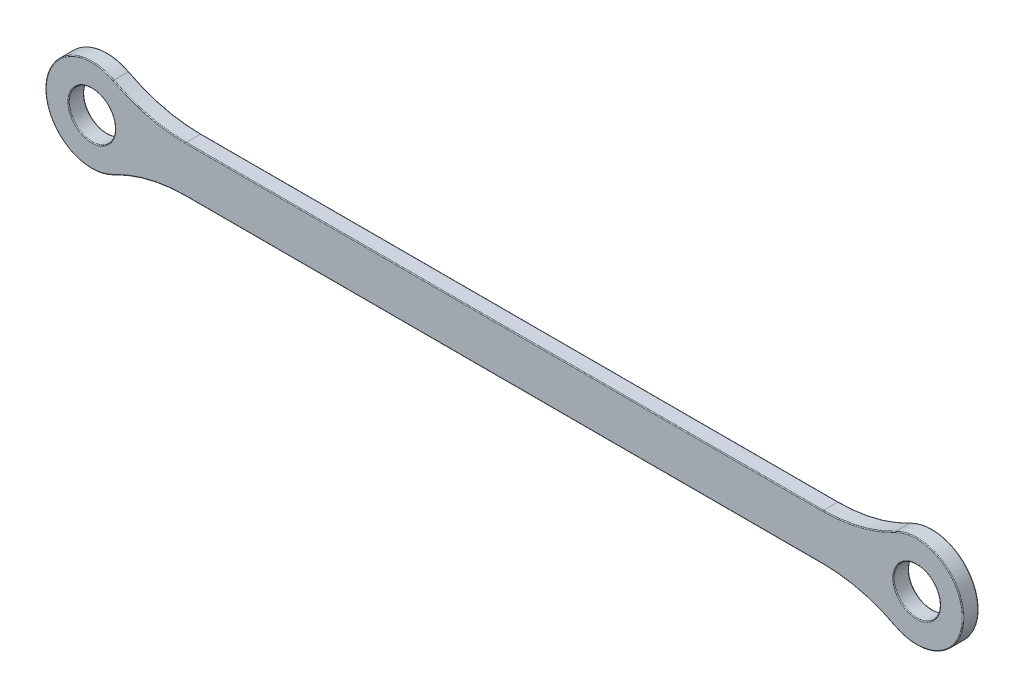
ISO-10303-21;
HEADER;
FILE_DESCRIPTION(('STEP AP214'),'2;1');
FILE_NAME('part.step','',(''),(''),'','','');
FILE_SCHEMA(('AUTOMOTIVE_DESIGN { 1 0 10303 214 1 1 1 1 }'));
ENDSEC;
DATA;
#1=APPLICATION_CONTEXT('core data for automotive mechanical design processes');
#2=APPLICATION_PROTOCOL_DEFINITION('international standard','automotive_design',2000,#1);
#3=PRODUCT_CONTEXT('',#1,'mechanical');
#4=PRODUCT('Part','Part','',(#3));
#5=PRODUCT_RELATED_PRODUCT_CATEGORY('part','',(#4));
#6=PRODUCT_DEFINITION_FORMATION('','',#4);
#7=PRODUCT_DEFINITION_CONTEXT('part definition',#1,'design');
#8=PRODUCT_DEFINITION('design','',#6,#7);
#9=PRODUCT_DEFINITION_SHAPE('','',#8);
#10=(LENGTH_UNIT() NAMED_UNIT(*) SI_UNIT(.MILLI.,.METRE.));
#11=(NAMED_UNIT(*) PLANE_ANGLE_UNIT() SI_UNIT($,.RADIAN.));
#12=(NAMED_UNIT(*) SI_UNIT($,.STERADIAN.) SOLID_ANGLE_UNIT());
#13=UNCERTAINTY_MEASURE_WITH_UNIT(LENGTH_MEASURE(1.E-05),#10,'distance_accuracy_value','');
#14=(GEOMETRIC_REPRESENTATION_CONTEXT(3) GLOBAL_UNCERTAINTY_ASSIGNED_CONTEXT((#13)) GLOBAL_UNIT_ASSIGNED_CONTEXT((#10,
#11,#12)) REPRESENTATION_CONTEXT('',''));
#15=CARTESIAN_POINT('',(0.,0.,0.));
#16=DIRECTION('',(0.,0.,1.));
#17=DIRECTION('',(1.,0.,0.));
#18=AXIS2_PLACEMENT_3D('',#15,#16,#17);
#19=CARTESIAN_POINT('',(-16.6441231158871,156.850203209432,3.));
#20=DIRECTION('',(0.,0.,-1.));
#21=DIRECTION('',(-1.,0.,0.));
#22=AXIS2_PLACEMENT_3D('',#19,#20,#21);
#23=CYLINDRICAL_SURFACE('',#22,9.00000000000002);
#24=DIRECTION('',(0.,0.,-1.));
#25=VECTOR('',#24,1.);
#26=CARTESIAN_POINT('',(-20.841015457304,164.811741670971,3.));
#27=LINE('',#26,#25);
#28=CARTESIAN_POINT('',(-20.841015457304,164.811741670971,0.15));
#29=VERTEX_POINT('',#28);
#30=CARTESIAN_POINT('',(-20.841015457304,164.811741670971,2.85));
#31=VERTEX_POINT('',#30);
#32=EDGE_CURVE('E303',#29,#31,#27,.F.);
#33=ORIENTED_EDGE('',*,*,#32,.T.);
#34=CARTESIAN_POINT('',(-16.6441231158871,156.850203209432,2.85));
#35=DIRECTION('',(0.,0.,1.));
#36=DIRECTION('',(1.,0.,0.));
#37=AXIS2_PLACEMENT_3D('',#34,#35,#36);
#38=CIRCLE('',#37,9.00000000000002);
#39=CARTESIAN_POINT('',(-20.841015457304,148.888664747894,2.85));
#40=VERTEX_POINT('',#39);
#41=EDGE_CURVE('E215',#31,#40,#38,.F.);
#42=ORIENTED_EDGE('',*,*,#41,.T.);
#43=DIRECTION('',(0.,0.,-1.));
#44=VECTOR('',#43,1.);
#45=CARTESIAN_POINT('',(-20.841015457304,148.888664747894,3.));
#46=LINE('',#45,#44);
#47=CARTESIAN_POINT('',(-20.841015457304,148.888664747894,0.15));
#48=VERTEX_POINT('',#47);
#49=EDGE_CURVE('E308',#40,#48,#46,.T.);
#50=ORIENTED_EDGE('',*,*,#49,.T.);
#51=CARTESIAN_POINT('',(-16.6441231158871,156.850203209432,0.15));
#52=DIRECTION('',(0.,0.,1.));
#53=DIRECTION('',(1.,0.,0.));
#54=AXIS2_PLACEMENT_3D('',#51,#52,#53);
#55=CIRCLE('',#54,9.00000000000002);
#56=EDGE_CURVE('E213',#48,#29,#55,.T.);
#57=ORIENTED_EDGE('',*,*,#56,.T.);
#58=EDGE_LOOP('',(#33,#42,#50,#57));
#59=FACE_BOUND('',#58,.T.);
#60=ADVANCED_FACE('F35',(#59),#23,.T.);
#61=CARTESIAN_POINT('',(0.,161.350203209432,3.));
#62=DIRECTION('',(0.,-1.,0.));
#63=DIRECTION('',(1.,0.,0.));
#64=AXIS2_PLACEMENT_3D('',#61,#62,#63);
#65=PLANE('',#64);
#66=DIRECTION('',(0.,0.,1.));
#67=VECTOR('',#66,1.);
#68=CARTESIAN_POINT('',(-158.457589636414,161.350203209432,3.));
#69=LINE('',#68,#67);
#70=CARTESIAN_POINT('',(-158.457589636414,161.350203209432,0.15));
#71=VERTEX_POINT('',#70);
#72=CARTESIAN_POINT('',(-158.457589636414,161.350203209432,2.85));
#73=VERTEX_POINT('',#72);
#74=EDGE_CURVE('E258',#71,#73,#69,.T.);
#75=ORIENTED_EDGE('',*,*,#74,.T.);
#76=DIRECTION('',(-1.,0.,0.));
#77=VECTOR('',#76,1.);
#78=CARTESIAN_POINT('',(-34.8306565953604,161.350203209432,2.85));
#79=LINE('',#78,#77);
#80=CARTESIAN_POINT('',(-34.8306565953604,161.350203209432,2.85));
#81=VERTEX_POINT('',#80);
#82=EDGE_CURVE('E206',#73,#81,#79,.F.);
#83=ORIENTED_EDGE('',*,*,#82,.T.);
#84=DIRECTION('',(0.,0.,1.));
#85=VECTOR('',#84,1.);
#86=CARTESIAN_POINT('',(-34.8306565953604,161.350203209432,0.));
#87=LINE('',#86,#85);
#88=CARTESIAN_POINT('',(-34.8306565953604,161.350203209432,0.15));
#89=VERTEX_POINT('',#88);
#90=EDGE_CURVE('E375',#81,#89,#87,.F.);
#91=ORIENTED_EDGE('',*,*,#90,.T.);
#92=DIRECTION('',(-1.,0.,0.));
#93=VECTOR('',#92,1.);
#94=CARTESIAN_POINT('',(0.,161.350203209432,0.15));
#95=LINE('',#94,#93);
#96=EDGE_CURVE('E204',#89,#71,#95,.T.);
#97=ORIENTED_EDGE('',*,*,#96,.T.);
#98=EDGE_LOOP('',(#75,#83,#91,#97));
#99=FACE_BOUND('',#98,.T.);
#100=ADVANCED_FACE('F385',(#99),#65,.F.);
#101=CARTESIAN_POINT('',(-176.644123115887,156.850203209432,3.));
#102=DIRECTION('',(0.,0.,-1.));
#103=DIRECTION('',(-1.,0.,0.));
#104=AXIS2_PLACEMENT_3D('',#101,#102,#103);
#105=CYLINDRICAL_SURFACE('',#104,9.00000000000001);
#106=DIRECTION('',(0.,0.,-1.));
#107=VECTOR('',#106,1.);
#108=CARTESIAN_POINT('',(-172.44723077447,148.888664747894,3.));
#109=LINE('',#108,#107);
#110=CARTESIAN_POINT('',(-172.44723077447,148.888664747894,0.15));
#111=VERTEX_POINT('',#110);
#112=CARTESIAN_POINT('',(-172.44723077447,148.888664747894,2.85));
#113=VERTEX_POINT('',#112);
#114=EDGE_CURVE('E297',#111,#113,#109,.F.);
#115=ORIENTED_EDGE('',*,*,#114,.T.);
#116=CARTESIAN_POINT('',(-176.644123115887,156.850203209432,2.85));
#117=DIRECTION('',(0.,0.,1.));
#118=DIRECTION('',(1.,0.,0.));
#119=AXIS2_PLACEMENT_3D('',#116,#117,#118);
#120=CIRCLE('',#119,9.00000000000001);
#121=CARTESIAN_POINT('',(-172.44723077447,164.811741670971,2.85));
#122=VERTEX_POINT('',#121);
#123=EDGE_CURVE('E198',#113,#122,#120,.F.);
#124=ORIENTED_EDGE('',*,*,#123,.T.);
#125=DIRECTION('',(0.,0.,-1.));
#126=VECTOR('',#125,1.);
#127=CARTESIAN_POINT('',(-172.44723077447,164.811741670971,3.));
#128=LINE('',#127,#126);
#129=CARTESIAN_POINT('',(-172.44723077447,164.811741670971,0.15));
#130=VERTEX_POINT('',#129);
#131=EDGE_CURVE('E305',#122,#130,#128,.T.);
#132=ORIENTED_EDGE('',*,*,#131,.T.);
#133=CARTESIAN_POINT('',(-176.644123115887,156.850203209432,0.15));
#134=DIRECTION('',(0.,0.,1.));
#135=DIRECTION('',(1.,0.,0.));
#136=AXIS2_PLACEMENT_3D('',#133,#134,#135);
#137=CIRCLE('',#136,9.00000000000001);
#138=EDGE_CURVE('E196',#130,#111,#137,.T.);
#139=ORIENTED_EDGE('',*,*,#138,.T.);
#140=EDGE_LOOP('',(#115,#124,#132,#139));
#141=FACE_BOUND('',#140,.T.);
#142=ADVANCED_FACE('F338',(#141),#105,.T.);
#143=CARTESIAN_POINT('',(-176.644123115887,156.850203209432,3.));
#144=DIRECTION('',(0.,0.,-1.));
#145=DIRECTION('',(-1.,0.,0.));
#146=AXIS2_PLACEMENT_3D('',#143,#144,#145);
#147=CYLINDRICAL_SURFACE('',#146,4.49999999999995);
#148=CARTESIAN_POINT('',(-176.644123115887,156.850203209432,2.85));
#149=DIRECTION('',(0.,0.,1.));
#150=DIRECTION('',(1.,0.,0.));
#151=AXIS2_PLACEMENT_3D('',#148,#149,#150);
#152=CIRCLE('',#151,4.49999999999995);
#153=CARTESIAN_POINT('',(-172.144123115887,156.850203209432,2.85));
#154=VERTEX_POINT('',#153);
#155=EDGE_CURVE('E190',#154,#154,#152,.T.);
#156=ORIENTED_EDGE('',*,*,#155,.T.);
#157=EDGE_LOOP('',(#156));
#158=FACE_BOUND('',#157,.T.);
#159=CARTESIAN_POINT('',(-176.644123115887,156.850203209432,0.15));
#160=DIRECTION('',(0.,0.,1.));
#161=DIRECTION('',(1.,0.,0.));
#162=AXIS2_PLACEMENT_3D('',#159,#160,#161);
#163=CIRCLE('',#162,4.49999999999995);
#164=CARTESIAN_POINT('',(-172.144123115887,156.850203209432,0.15));
#165=VERTEX_POINT('',#164);
#166=EDGE_CURVE('E187',#165,#165,#163,.F.);
#167=ORIENTED_EDGE('',*,*,#166,.T.);
#168=EDGE_LOOP('',(#167));
#169=FACE_BOUND('',#168,.T.);
#170=ADVANCED_FACE('F394',(#158,#169),#147,.F.);
#171=CARTESIAN_POINT('',(0.,152.350203209432,3.));
#172=DIRECTION('',(0.,-1.,0.));
#173=DIRECTION('',(1.,0.,0.));
#174=AXIS2_PLACEMENT_3D('',#171,#172,#173);
#175=PLANE('',#174);
#176=DIRECTION('',(0.,0.,-1.));
#177=VECTOR('',#176,1.);
#178=CARTESIAN_POINT('',(-34.8306565953605,152.350203209432,3.));
#179=LINE('',#178,#177);
#180=CARTESIAN_POINT('',(-34.8306565953605,152.350203209432,0.15));
#181=VERTEX_POINT('',#180);
#182=CARTESIAN_POINT('',(-34.8306565953605,152.350203209432,2.85));
#183=VERTEX_POINT('',#182);
#184=EDGE_CURVE('E302',#181,#183,#179,.F.);
#185=ORIENTED_EDGE('',*,*,#184,.T.);
#186=DIRECTION('',(-1.,0.,0.));
#187=VECTOR('',#186,1.);
#188=CARTESIAN_POINT('',(0.,152.350203209432,2.85));
#189=LINE('',#188,#187);
#190=CARTESIAN_POINT('',(-158.457589636414,152.350203209432,2.85));
#191=VERTEX_POINT('',#190);
#192=EDGE_CURVE('E223',#183,#191,#189,.T.);
#193=ORIENTED_EDGE('',*,*,#192,.T.);
#194=DIRECTION('',(0.,0.,-1.));
#195=VECTOR('',#194,1.);
#196=CARTESIAN_POINT('',(-158.457589636414,152.350203209432,3.));
#197=LINE('',#196,#195);
#198=CARTESIAN_POINT('',(-158.457589636414,152.350203209432,0.15));
#199=VERTEX_POINT('',#198);
#200=EDGE_CURVE('E295',#191,#199,#197,.T.);
#201=ORIENTED_EDGE('',*,*,#200,.T.);
#202=DIRECTION('',(-1.,0.,0.));
#203=VECTOR('',#202,1.);
#204=CARTESIAN_POINT('',(-34.8306565953605,152.350203209432,0.15));
#205=LINE('',#204,#203);
#206=EDGE_CURVE('E221',#199,#181,#205,.F.);
#207=ORIENTED_EDGE('',*,*,#206,.T.);
#208=EDGE_LOOP('',(#185,#193,#201,#207));
#209=FACE_BOUND('',#208,.T.);
#210=ADVANCED_FACE('F300',(#209),#175,.T.);
#211=CARTESIAN_POINT('',(-16.6441231158871,156.850203209432,3.));
#212=DIRECTION('',(0.,0.,-1.));
#213=DIRECTION('',(-1.,0.,0.));
#214=AXIS2_PLACEMENT_3D('',#211,#212,#213);
#215=CYLINDRICAL_SURFACE('',#214,4.49999999999995);
#216=CARTESIAN_POINT('',(-16.6441231158871,156.850203209432,2.85));
#217=DIRECTION('',(0.,0.,1.));
#218=DIRECTION('',(1.,0.,0.));
#219=AXIS2_PLACEMENT_3D('',#216,#217,#218);
#220=CIRCLE('',#219,4.49999999999995);
#221=CARTESIAN_POINT('',(-12.1441231158872,156.850203209432,2.85));
#222=VERTEX_POINT('',#221);
#223=EDGE_CURVE('E170',#222,#222,#220,.T.);
#224=ORIENTED_EDGE('',*,*,#223,.T.);
#225=EDGE_LOOP('',(#224));
#226=FACE_BOUND('',#225,.T.);
#227=CARTESIAN_POINT('',(-16.6441231158871,156.850203209432,0.15));
#228=DIRECTION('',(0.,0.,1.));
#229=DIRECTION('',(1.,0.,0.));
#230=AXIS2_PLACEMENT_3D('',#227,#228,#229);
#231=CIRCLE('',#230,4.49999999999995);
#232=CARTESIAN_POINT('',(-12.1441231158872,156.850203209432,0.15));
#233=VERTEX_POINT('',#232);
#234=EDGE_CURVE('E315',#233,#233,#231,.F.);
#235=ORIENTED_EDGE('',*,*,#234,.T.);
#236=EDGE_LOOP('',(#235));
#237=FACE_BOUND('',#236,.T.);
#238=ADVANCED_FACE('F540',(#226,#237),#215,.F.);
#239=CARTESIAN_POINT('',(0.,0.,3.));
#240=DIRECTION('',(0.,0.,1.));
#241=DIRECTION('',(1.,0.,0.));
#242=AXIS2_PLACEMENT_3D('',#239,#240,#241);
#243=PLANE('',#242);
#244=CARTESIAN_POINT('',(-16.6441231158871,156.850203209432,3.));
#245=DIRECTION('',(0.,0.,1.));
#246=DIRECTION('',(1.,0.,0.));
#247=AXIS2_PLACEMENT_3D('',#244,#245,#246);
#248=CIRCLE('',#247,4.64999999999995);
#249=CARTESIAN_POINT('',(-11.9941231158872,156.850203209432,3.));
#250=VERTEX_POINT('',#249);
#251=EDGE_CURVE('E179',#250,#250,#248,.F.);
#252=ORIENTED_EDGE('',*,*,#251,.T.);
#253=EDGE_LOOP('',(#252));
#254=FACE_BOUND('',#253,.T.);
#255=CARTESIAN_POINT('',(-176.644123115887,156.850203209432,3.));
#256=DIRECTION('',(0.,0.,1.));
#257=DIRECTION('',(1.,0.,0.));
#258=AXIS2_PLACEMENT_3D('',#255,#256,#257);
#259=CIRCLE('',#258,4.64999999999995);
#260=CARTESIAN_POINT('',(-171.994123115887,156.850203209432,3.));
#261=VERTEX_POINT('',#260);
#262=EDGE_CURVE('E176',#261,#261,#259,.F.);
#263=ORIENTED_EDGE('',*,*,#262,.T.);
#264=EDGE_LOOP('',(#263));
#265=FACE_BOUND('',#264,.T.);
#266=CARTESIAN_POINT('',(-176.644123115887,156.850203209432,3.));
#267=DIRECTION('',(0.,0.,1.));
#268=DIRECTION('',(1.,0.,0.));
#269=AXIS2_PLACEMENT_3D('',#266,#267,#268);
#270=CIRCLE('',#269,8.85000000000001);
#271=CARTESIAN_POINT('',(-172.51717898016,164.679049363278,3.));
#272=VERTEX_POINT('',#271);
#273=CARTESIAN_POINT('',(-172.517178980161,149.021357055586,3.));
#274=VERTEX_POINT('',#273);
#275=EDGE_CURVE('E174',#272,#274,#270,.T.);
#276=ORIENTED_EDGE('',*,*,#275,.T.);
#277=CARTESIAN_POINT('',(-158.457589636414,122.350203209432,3.));
#278=DIRECTION('',(0.,0.,1.));
#279=DIRECTION('',(1.,0.,0.));
#280=AXIS2_PLACEMENT_3D('',#277,#278,#279);
#281=CIRCLE('',#280,30.15);
#282=CARTESIAN_POINT('',(-158.457589636414,152.500203209432,3.));
#283=VERTEX_POINT('',#282);
#284=EDGE_CURVE('E155',#274,#283,#281,.F.);
#285=ORIENTED_EDGE('',*,*,#284,.T.);
#286=DIRECTION('',(-1.,0.,0.));
#287=VECTOR('',#286,1.);
#288=CARTESIAN_POINT('',(0.,152.500203209432,3.));
#289=LINE('',#288,#287);
#290=CARTESIAN_POINT('',(-34.8306565953605,152.500203209432,3.));
#291=VERTEX_POINT('',#290);
#292=EDGE_CURVE('E163',#283,#291,#289,.F.);
#293=ORIENTED_EDGE('',*,*,#292,.T.);
#294=CARTESIAN_POINT('',(-34.8306565953605,122.350203209432,3.));
#295=DIRECTION('',(0.,0.,1.));
#296=DIRECTION('',(1.,0.,0.));
#297=AXIS2_PLACEMENT_3D('',#294,#295,#296);
#298=CIRCLE('',#297,30.15);
#299=CARTESIAN_POINT('',(-20.7710672516138,149.021357055586,3.));
#300=VERTEX_POINT('',#299);
#301=EDGE_CURVE('E169',#291,#300,#298,.F.);
#302=ORIENTED_EDGE('',*,*,#301,.T.);
#303=CARTESIAN_POINT('',(-16.6441231158871,156.850203209432,3.));
#304=DIRECTION('',(0.,0.,1.));
#305=DIRECTION('',(1.,0.,0.));
#306=AXIS2_PLACEMENT_3D('',#303,#304,#305);
#307=CIRCLE('',#306,8.85000000000002);
#308=CARTESIAN_POINT('',(-20.7710672516138,164.679049363278,3.));
#309=VERTEX_POINT('',#308);
#310=EDGE_CURVE('E321',#300,#309,#307,.T.);
#311=ORIENTED_EDGE('',*,*,#310,.T.);
#312=CARTESIAN_POINT('',(-34.8306565953604,191.350203209432,3.));
#313=DIRECTION('',(0.,0.,1.));
#314=DIRECTION('',(1.,0.,0.));
#315=AXIS2_PLACEMENT_3D('',#312,#313,#314);
#316=CIRCLE('',#315,30.15);
#317=CARTESIAN_POINT('',(-34.8306565953604,161.200203209432,3.));
#318=VERTEX_POINT('',#317);
#319=EDGE_CURVE('E323',#309,#318,#316,.F.);
#320=ORIENTED_EDGE('',*,*,#319,.T.);
#321=DIRECTION('',(-1.,0.,0.));
#322=VECTOR('',#321,1.);
#323=CARTESIAN_POINT('',(-158.457589636414,161.200203209432,3.));
#324=LINE('',#323,#322);
#325=CARTESIAN_POINT('',(-158.457589636414,161.200203209432,3.));
#326=VERTEX_POINT('',#325);
#327=EDGE_CURVE('E325',#318,#326,#324,.T.);
#328=ORIENTED_EDGE('',*,*,#327,.T.);
#329=CARTESIAN_POINT('',(-158.457589636414,191.350203209432,3.));
#330=DIRECTION('',(0.,0.,1.));
#331=DIRECTION('',(1.,0.,0.));
#332=AXIS2_PLACEMENT_3D('',#329,#330,#331);
#333=CIRCLE('',#332,30.15);
#334=EDGE_CURVE('E181',#326,#272,#333,.F.);
#335=ORIENTED_EDGE('',*,*,#334,.T.);
#336=EDGE_LOOP('',(#276,#285,#293,#302,#311,#320,#328,#335));
#337=FACE_BOUND('',#336,.T.);
#338=ADVANCED_FACE('F172',(#254,#265,#337),#243,.T.);
#339=CARTESIAN_POINT('',(0.,0.,0.));
#340=DIRECTION('',(0.,0.,1.));
#341=DIRECTION('',(1.,0.,0.));
#342=AXIS2_PLACEMENT_3D('',#339,#340,#341);
#343=PLANE('',#342);
#344=CARTESIAN_POINT('',(-16.6441231158871,156.850203209432,0.));
#345=DIRECTION('',(0.,0.,1.));
#346=DIRECTION('',(1.,0.,0.));
#347=AXIS2_PLACEMENT_3D('',#344,#345,#346);
#348=CIRCLE('',#347,4.64999999999995);
#349=CARTESIAN_POINT('',(-11.9941231158872,156.850203209432,0.));
#350=VERTEX_POINT('',#349);
#351=EDGE_CURVE('E11',#350,#350,#348,.T.);
#352=ORIENTED_EDGE('',*,*,#351,.T.);
#353=EDGE_LOOP('',(#352));
#354=FACE_BOUND('',#353,.T.);
#355=CARTESIAN_POINT('',(-176.644123115887,156.850203209432,0.));
#356=DIRECTION('',(0.,0.,1.));
#357=DIRECTION('',(1.,0.,0.));
#358=AXIS2_PLACEMENT_3D('',#355,#356,#357);
#359=CIRCLE('',#358,4.64999999999995);
#360=CARTESIAN_POINT('',(-171.994123115887,156.850203209432,0.));
#361=VERTEX_POINT('',#360);
#362=EDGE_CURVE('E44',#361,#361,#359,.T.);
#363=ORIENTED_EDGE('',*,*,#362,.T.);
#364=EDGE_LOOP('',(#363));
#365=FACE_BOUND('',#364,.T.);
#366=DIRECTION('',(-1.,0.,0.));
#367=VECTOR('',#366,1.);
#368=CARTESIAN_POINT('',(0.,161.200203209432,0.));
#369=LINE('',#368,#367);
#370=CARTESIAN_POINT('',(-158.457589636414,161.200203209432,0.));
#371=VERTEX_POINT('',#370);
#372=CARTESIAN_POINT('',(-34.8306565953604,161.200203209432,0.));
#373=VERTEX_POINT('',#372);
#374=EDGE_CURVE('E52',#371,#373,#369,.F.);
#375=ORIENTED_EDGE('',*,*,#374,.T.);
#376=CARTESIAN_POINT('',(-34.8306565953604,191.350203209432,0.));
#377=DIRECTION('',(0.,0.,1.));
#378=DIRECTION('',(1.,0.,0.));
#379=AXIS2_PLACEMENT_3D('',#376,#377,#378);
#380=CIRCLE('',#379,30.15);
#381=CARTESIAN_POINT('',(-20.7710672516138,164.679049363278,0.));
#382=VERTEX_POINT('',#381);
#383=EDGE_CURVE('E237',#373,#382,#380,.T.);
#384=ORIENTED_EDGE('',*,*,#383,.T.);
#385=CARTESIAN_POINT('',(-16.6441231158871,156.850203209432,0.));
#386=DIRECTION('',(0.,0.,1.));
#387=DIRECTION('',(1.,0.,0.));
#388=AXIS2_PLACEMENT_3D('',#385,#386,#387);
#389=CIRCLE('',#388,8.85000000000002);
#390=CARTESIAN_POINT('',(-20.7710672516138,149.021357055586,0.));
#391=VERTEX_POINT('',#390);
#392=EDGE_CURVE('E225',#382,#391,#389,.F.);
#393=ORIENTED_EDGE('',*,*,#392,.T.);
#394=CARTESIAN_POINT('',(-34.8306565953605,122.350203209432,0.));
#395=DIRECTION('',(0.,0.,1.));
#396=DIRECTION('',(1.,0.,0.));
#397=AXIS2_PLACEMENT_3D('',#394,#395,#396);
#398=CIRCLE('',#397,30.15);
#399=CARTESIAN_POINT('',(-34.8306565953605,152.500203209432,0.));
#400=VERTEX_POINT('',#399);
#401=EDGE_CURVE('E227',#391,#400,#398,.T.);
#402=ORIENTED_EDGE('',*,*,#401,.T.);
#403=DIRECTION('',(-1.,0.,0.));
#404=VECTOR('',#403,1.);
#405=CARTESIAN_POINT('',(-158.457589636414,152.500203209432,0.));
#406=LINE('',#405,#404);
#407=CARTESIAN_POINT('',(-158.457589636414,152.500203209432,0.));
#408=VERTEX_POINT('',#407);
#409=EDGE_CURVE('E229',#400,#408,#406,.T.);
#410=ORIENTED_EDGE('',*,*,#409,.T.);
#411=CARTESIAN_POINT('',(-158.457589636414,122.350203209432,0.));
#412=DIRECTION('',(0.,0.,1.));
#413=DIRECTION('',(1.,0.,0.));
#414=AXIS2_PLACEMENT_3D('',#411,#412,#413);
#415=CIRCLE('',#414,30.15);
#416=CARTESIAN_POINT('',(-172.517178980161,149.021357055586,0.));
#417=VERTEX_POINT('',#416);
#418=EDGE_CURVE('E231',#408,#417,#415,.T.);
#419=ORIENTED_EDGE('',*,*,#418,.T.);
#420=CARTESIAN_POINT('',(-176.644123115887,156.850203209432,0.));
#421=DIRECTION('',(0.,0.,1.));
#422=DIRECTION('',(1.,0.,0.));
#423=AXIS2_PLACEMENT_3D('',#420,#421,#422);
#424=CIRCLE('',#423,8.85000000000001);
#425=CARTESIAN_POINT('',(-172.51717898016,164.679049363278,0.));
#426=VERTEX_POINT('',#425);
#427=EDGE_CURVE('E233',#417,#426,#424,.F.);
#428=ORIENTED_EDGE('',*,*,#427,.T.);
#429=CARTESIAN_POINT('',(-158.457589636414,191.350203209432,0.));
#430=DIRECTION('',(0.,0.,1.));
#431=DIRECTION('',(1.,0.,0.));
#432=AXIS2_PLACEMENT_3D('',#429,#430,#431);
#433=CIRCLE('',#432,30.15);
#434=EDGE_CURVE('E57',#426,#371,#433,.T.);
#435=ORIENTED_EDGE('',*,*,#434,.T.);
#436=EDGE_LOOP('',(#375,#384,#393,#402,#410,#419,#428,#435));
#437=FACE_BOUND('',#436,.T.);
#438=ADVANCED_FACE('F355',(#354,#365,#437),#343,.F.);
#439=CARTESIAN_POINT('',(-34.8306565953604,191.350203209432,3.));
#440=DIRECTION('',(0.,0.,-1.));
#441=DIRECTION('',(-1.,0.,0.));
#442=AXIS2_PLACEMENT_3D('',#439,#440,#441);
#443=CYLINDRICAL_SURFACE('',#442,30.);
#444=ORIENTED_EDGE('',*,*,#90,.F.);
#445=CARTESIAN_POINT('',(-34.8306565953604,191.350203209432,2.85));
#446=DIRECTION('',(0.,0.,1.));
#447=DIRECTION('',(1.,0.,0.));
#448=AXIS2_PLACEMENT_3D('',#445,#446,#447);
#449=CIRCLE('',#448,30.);
#450=EDGE_CURVE('E211',#81,#31,#449,.T.);
#451=ORIENTED_EDGE('',*,*,#450,.T.);
#452=ORIENTED_EDGE('',*,*,#32,.F.);
#453=CARTESIAN_POINT('',(-34.8306565953604,191.350203209432,0.15));
#454=DIRECTION('',(0.,0.,1.));
#455=DIRECTION('',(1.,0.,0.));
#456=AXIS2_PLACEMENT_3D('',#453,#454,#455);
#457=CIRCLE('',#456,30.);
#458=EDGE_CURVE('E208',#29,#89,#457,.F.);
#459=ORIENTED_EDGE('',*,*,#458,.T.);
#460=EDGE_LOOP('',(#444,#451,#452,#459));
#461=FACE_BOUND('',#460,.T.);
#462=ADVANCED_FACE('F372',(#461),#443,.F.);
#463=CARTESIAN_POINT('',(-34.8306565953605,122.350203209432,3.));
#464=DIRECTION('',(0.,0.,-1.));
#465=DIRECTION('',(-1.,0.,0.));
#466=AXIS2_PLACEMENT_3D('',#463,#464,#465);
#467=CYLINDRICAL_SURFACE('',#466,30.);
#468=ORIENTED_EDGE('',*,*,#49,.F.);
#469=CARTESIAN_POINT('',(-34.8306565953605,122.350203209432,2.85));
#470=DIRECTION('',(0.,0.,1.));
#471=DIRECTION('',(1.,0.,0.));
#472=AXIS2_PLACEMENT_3D('',#469,#470,#471);
#473=CIRCLE('',#472,30.);
#474=EDGE_CURVE('E219',#40,#183,#473,.T.);
#475=ORIENTED_EDGE('',*,*,#474,.T.);
#476=ORIENTED_EDGE('',*,*,#184,.F.);
#477=CARTESIAN_POINT('',(-34.8306565953605,122.350203209432,0.15));
#478=DIRECTION('',(0.,0.,1.));
#479=DIRECTION('',(1.,0.,0.));
#480=AXIS2_PLACEMENT_3D('',#477,#478,#479);
#481=CIRCLE('',#480,30.);
#482=EDGE_CURVE('E217',#181,#48,#481,.F.);
#483=ORIENTED_EDGE('',*,*,#482,.T.);
#484=EDGE_LOOP('',(#468,#475,#476,#483));
#485=FACE_BOUND('',#484,.T.);
#486=ADVANCED_FACE('F401',(#485),#467,.F.);
#487=CARTESIAN_POINT('',(-158.457589636414,122.350203209432,3.));
#488=DIRECTION('',(0.,0.,-1.));
#489=DIRECTION('',(-1.,0.,0.));
#490=AXIS2_PLACEMENT_3D('',#487,#488,#489);
#491=CYLINDRICAL_SURFACE('',#490,30.);
#492=ORIENTED_EDGE('',*,*,#200,.F.);
#493=CARTESIAN_POINT('',(-158.457589636414,122.350203209432,2.85));
#494=DIRECTION('',(0.,0.,1.));
#495=DIRECTION('',(1.,0.,0.));
#496=AXIS2_PLACEMENT_3D('',#493,#494,#495);
#497=CIRCLE('',#496,30.);
#498=EDGE_CURVE('E157',#191,#113,#497,.T.);
#499=ORIENTED_EDGE('',*,*,#498,.T.);
#500=ORIENTED_EDGE('',*,*,#114,.F.);
#501=CARTESIAN_POINT('',(-158.457589636414,122.350203209432,0.15));
#502=DIRECTION('',(0.,0.,1.));
#503=DIRECTION('',(1.,0.,0.));
#504=AXIS2_PLACEMENT_3D('',#501,#502,#503);
#505=CIRCLE('',#504,30.);
#506=EDGE_CURVE('E193',#111,#199,#505,.F.);
#507=ORIENTED_EDGE('',*,*,#506,.T.);
#508=EDGE_LOOP('',(#492,#499,#500,#507));
#509=FACE_BOUND('',#508,.T.);
#510=ADVANCED_FACE('F294',(#509),#491,.F.);
#511=CARTESIAN_POINT('',(-158.457589636414,191.350203209432,3.));
#512=DIRECTION('',(0.,0.,-1.));
#513=DIRECTION('',(-1.,0.,0.));
#514=AXIS2_PLACEMENT_3D('',#511,#512,#513);
#515=CYLINDRICAL_SURFACE('',#514,30.);
#516=ORIENTED_EDGE('',*,*,#131,.F.);
#517=CARTESIAN_POINT('',(-158.457589636414,191.350203209432,2.85));
#518=DIRECTION('',(0.,0.,1.));
#519=DIRECTION('',(1.,0.,0.));
#520=AXIS2_PLACEMENT_3D('',#517,#518,#519);
#521=CIRCLE('',#520,30.);
#522=EDGE_CURVE('E202',#122,#73,#521,.T.);
#523=ORIENTED_EDGE('',*,*,#522,.T.);
#524=ORIENTED_EDGE('',*,*,#74,.F.);
#525=CARTESIAN_POINT('',(-158.457589636414,191.350203209432,0.15));
#526=DIRECTION('',(0.,0.,1.));
#527=DIRECTION('',(1.,0.,0.));
#528=AXIS2_PLACEMENT_3D('',#525,#526,#527);
#529=CIRCLE('',#528,30.);
#530=EDGE_CURVE('E200',#71,#130,#529,.F.);
#531=ORIENTED_EDGE('',*,*,#530,.T.);
#532=EDGE_LOOP('',(#516,#523,#524,#531));
#533=FACE_BOUND('',#532,.T.);
#534=ADVANCED_FACE('F340',(#533),#515,.F.);
#535=CARTESIAN_POINT('',(-16.6441231158871,156.850203209432,2.85));
#536=DIRECTION('',(0.,0.,1.));
#537=DIRECTION('',(1.,0.,0.));
#538=AXIS2_PLACEMENT_3D('',#535,#536,#537);
#539=TOROIDAL_SURFACE('',#538,4.64999999999995,0.15);
#540=ORIENTED_EDGE('',*,*,#251,.F.);
#541=EDGE_LOOP('',(#540));
#542=FACE_BOUND('',#541,.T.);
#543=ORIENTED_EDGE('',*,*,#223,.F.);
#544=EDGE_LOOP('',(#543));
#545=FACE_BOUND('',#544,.T.);
#546=ADVANCED_FACE('F409',(#542,#545),#539,.T.);
#547=CARTESIAN_POINT('',(-176.644123115887,156.850203209432,2.85));
#548=DIRECTION('',(0.,0.,1.));
#549=DIRECTION('',(1.,0.,0.));
#550=AXIS2_PLACEMENT_3D('',#547,#548,#549);
#551=TOROIDAL_SURFACE('',#550,4.64999999999995,0.15);
#552=ORIENTED_EDGE('',*,*,#262,.F.);
#553=EDGE_LOOP('',(#552));
#554=FACE_BOUND('',#553,.T.);
#555=ORIENTED_EDGE('',*,*,#155,.F.);
#556=EDGE_LOOP('',(#555));
#557=FACE_BOUND('',#556,.T.);
#558=ADVANCED_FACE('F412',(#554,#557),#551,.T.);
#559=CARTESIAN_POINT('',(-34.8306565953604,191.350203209432,2.85));
#560=DIRECTION('',(0.,0.,1.));
#561=DIRECTION('',(1.,0.,0.));
#562=AXIS2_PLACEMENT_3D('',#559,#560,#561);
#563=TOROIDAL_SURFACE('',#562,30.15,0.15);
#564=CARTESIAN_POINT('',(-20.7710672516138,164.679049363278,2.85));
#565=DIRECTION('',(0.884615384615384,0.466321371268546,0.));
#566=DIRECTION('',(-0.466321371268546,0.884615384615384,0.));
#567=AXIS2_PLACEMENT_3D('',#564,#565,#566);
#568=CIRCLE('',#567,0.15);
#569=EDGE_CURVE('E252',#31,#309,#568,.T.);
#570=ORIENTED_EDGE('',*,*,#569,.F.);
#571=ORIENTED_EDGE('',*,*,#450,.F.);
#572=CARTESIAN_POINT('',(-34.8306565953604,161.200203209432,2.85));
#573=DIRECTION('',(-1.,0.,0.));
#574=DIRECTION('',(0.,0.,1.));
#575=AXIS2_PLACEMENT_3D('',#572,#573,#574);
#576=CIRCLE('',#575,0.15);
#577=EDGE_CURVE('E255',#318,#81,#576,.T.);
#578=ORIENTED_EDGE('',*,*,#577,.F.);
#579=ORIENTED_EDGE('',*,*,#319,.F.);
#580=EDGE_LOOP('',(#570,#571,#578,#579));
#581=FACE_BOUND('',#580,.T.);
#582=ADVANCED_FACE('F378',(#581),#563,.T.);
#583=CARTESIAN_POINT('',(0.,161.200203209432,2.85));
#584=DIRECTION('',(1.,0.,0.));
#585=DIRECTION('',(0.,1.,0.));
#586=AXIS2_PLACEMENT_3D('',#583,#584,#585);
#587=CYLINDRICAL_SURFACE('',#586,0.15);
#588=ORIENTED_EDGE('',*,*,#577,.T.);
#589=ORIENTED_EDGE('',*,*,#82,.F.);
#590=CARTESIAN_POINT('',(-158.457589636414,161.200203209432,2.85));
#591=DIRECTION('',(-1.,0.,0.));
#592=DIRECTION('',(0.,0.,1.));
#593=AXIS2_PLACEMENT_3D('',#590,#591,#592);
#594=CIRCLE('',#593,0.15);
#595=EDGE_CURVE('E249',#326,#73,#594,.T.);
#596=ORIENTED_EDGE('',*,*,#595,.F.);
#597=ORIENTED_EDGE('',*,*,#327,.F.);
#598=EDGE_LOOP('',(#588,#589,#596,#597));
#599=FACE_BOUND('',#598,.T.);
#600=ADVANCED_FACE('F383',(#599),#587,.T.);
#601=CARTESIAN_POINT('',(-16.6441231158871,156.850203209432,2.85));
#602=DIRECTION('',(0.,0.,1.));
#603=DIRECTION('',(1.,0.,0.));
#604=AXIS2_PLACEMENT_3D('',#601,#602,#603);
#605=TOROIDAL_SURFACE('',#604,8.85000000000002,0.15);
#606=ORIENTED_EDGE('',*,*,#569,.T.);
#607=ORIENTED_EDGE('',*,*,#310,.F.);
#608=CARTESIAN_POINT('',(-20.7710672516138,149.021357055586,2.85));
#609=DIRECTION('',(-0.884615384615383,0.466321371268546,0.));
#610=DIRECTION('',(-0.466321371268546,-0.884615384615384,0.));
#611=AXIS2_PLACEMENT_3D('',#608,#609,#610);
#612=CIRCLE('',#611,0.15);
#613=EDGE_CURVE('E246',#40,#300,#612,.T.);
#614=ORIENTED_EDGE('',*,*,#613,.F.);
#615=ORIENTED_EDGE('',*,*,#41,.F.);
#616=EDGE_LOOP('',(#606,#607,#614,#615));
#617=FACE_BOUND('',#616,.T.);
#618=ADVANCED_FACE('F430',(#617),#605,.T.);
#619=CARTESIAN_POINT('',(-158.457589636414,191.350203209432,2.85));
#620=DIRECTION('',(0.,0.,1.));
#621=DIRECTION('',(1.,0.,0.));
#622=AXIS2_PLACEMENT_3D('',#619,#620,#621);
#623=TOROIDAL_SURFACE('',#622,30.15,0.15);
#624=ORIENTED_EDGE('',*,*,#595,.T.);
#625=ORIENTED_EDGE('',*,*,#522,.F.);
#626=CARTESIAN_POINT('',(-172.51717898016,164.679049363278,2.85));
#627=DIRECTION('',(-0.884615384615374,0.466321371268564,0.));
#628=DIRECTION('',(-0.466321371268564,-0.884615384615374,0.));
#629=AXIS2_PLACEMENT_3D('',#626,#627,#628);
#630=CIRCLE('',#629,0.15);
#631=EDGE_CURVE('E243',#272,#122,#630,.T.);
#632=ORIENTED_EDGE('',*,*,#631,.F.);
#633=ORIENTED_EDGE('',*,*,#334,.F.);
#634=EDGE_LOOP('',(#624,#625,#632,#633));
#635=FACE_BOUND('',#634,.T.);
#636=ADVANCED_FACE('F332',(#635),#623,.T.);
#637=CARTESIAN_POINT('',(-34.8306565953605,122.350203209432,2.85));
#638=DIRECTION('',(0.,0.,1.));
#639=DIRECTION('',(1.,0.,0.));
#640=AXIS2_PLACEMENT_3D('',#637,#638,#639);
#641=TOROIDAL_SURFACE('',#640,30.15,0.15);
#642=ORIENTED_EDGE('',*,*,#613,.T.);
#643=ORIENTED_EDGE('',*,*,#301,.F.);
#644=CARTESIAN_POINT('',(-34.8306565953605,152.500203209432,2.85));
#645=DIRECTION('',(-1.,0.,0.));
#646=DIRECTION('',(0.,0.,1.));
#647=AXIS2_PLACEMENT_3D('',#644,#645,#646);
#648=CIRCLE('',#647,0.15);
#649=EDGE_CURVE('E166',#183,#291,#648,.T.);
#650=ORIENTED_EDGE('',*,*,#649,.F.);
#651=ORIENTED_EDGE('',*,*,#474,.F.);
#652=EDGE_LOOP('',(#642,#643,#650,#651));
#653=FACE_BOUND('',#652,.T.);
#654=ADVANCED_FACE('F424',(#653),#641,.T.);
#655=CARTESIAN_POINT('',(-176.644123115887,156.850203209432,2.85));
#656=DIRECTION('',(0.,0.,1.));
#657=DIRECTION('',(1.,0.,0.));
#658=AXIS2_PLACEMENT_3D('',#655,#656,#657);
#659=TOROIDAL_SURFACE('',#658,8.85000000000001,0.15);
#660=ORIENTED_EDGE('',*,*,#631,.T.);
#661=ORIENTED_EDGE('',*,*,#123,.F.);
#662=CARTESIAN_POINT('',(-172.517178980161,149.021357055586,2.85));
#663=DIRECTION('',(0.884615384615374,0.466321371268564,0.));
#664=DIRECTION('',(-0.466321371268564,0.884615384615374,0.));
#665=AXIS2_PLACEMENT_3D('',#662,#663,#664);
#666=CIRCLE('',#665,0.15);
#667=EDGE_CURVE('E160',#274,#113,#666,.T.);
#668=ORIENTED_EDGE('',*,*,#667,.F.);
#669=ORIENTED_EDGE('',*,*,#275,.F.);
#670=EDGE_LOOP('',(#660,#661,#668,#669));
#671=FACE_BOUND('',#670,.T.);
#672=ADVANCED_FACE('F335',(#671),#659,.T.);
#673=CARTESIAN_POINT('',(0.,152.500203209432,2.85));
#674=DIRECTION('',(-1.,0.,0.));
#675=DIRECTION('',(0.,-1.,0.));
#676=AXIS2_PLACEMENT_3D('',#673,#674,#675);
#677=CYLINDRICAL_SURFACE('',#676,0.15);
#678=ORIENTED_EDGE('',*,*,#649,.T.);
#679=ORIENTED_EDGE('',*,*,#292,.F.);
#680=CARTESIAN_POINT('',(-158.457589636414,152.500203209432,2.85));
#681=DIRECTION('',(-1.,0.,0.));
#682=DIRECTION('',(0.,0.,1.));
#683=AXIS2_PLACEMENT_3D('',#680,#681,#682);
#684=CIRCLE('',#683,0.15);
#685=EDGE_CURVE('E151',#191,#283,#684,.T.);
#686=ORIENTED_EDGE('',*,*,#685,.F.);
#687=ORIENTED_EDGE('',*,*,#192,.F.);
#688=EDGE_LOOP('',(#678,#679,#686,#687));
#689=FACE_BOUND('',#688,.T.);
#690=ADVANCED_FACE('F164',(#689),#677,.T.);
#691=CARTESIAN_POINT('',(-158.457589636414,122.350203209432,2.85));
#692=DIRECTION('',(0.,0.,1.));
#693=DIRECTION('',(1.,0.,0.));
#694=AXIS2_PLACEMENT_3D('',#691,#692,#693);
#695=TOROIDAL_SURFACE('',#694,30.15,0.15);
#696=ORIENTED_EDGE('',*,*,#667,.T.);
#697=ORIENTED_EDGE('',*,*,#498,.F.);
#698=ORIENTED_EDGE('',*,*,#685,.T.);
#699=ORIENTED_EDGE('',*,*,#284,.F.);
#700=EDGE_LOOP('',(#696,#697,#698,#699));
#701=FACE_BOUND('',#700,.T.);
#702=ADVANCED_FACE('F153',(#701),#695,.T.);
#703=CARTESIAN_POINT('',(-16.6441231158871,156.850203209432,0.15));
#704=DIRECTION('',(0.,0.,1.));
#705=DIRECTION('',(1.,0.,0.));
#706=AXIS2_PLACEMENT_3D('',#703,#704,#705);
#707=TOROIDAL_SURFACE('',#706,4.64999999999995,0.15);
#708=ORIENTED_EDGE('',*,*,#234,.F.);
#709=EDGE_LOOP('',(#708));
#710=FACE_BOUND('',#709,.T.);
#711=ORIENTED_EDGE('',*,*,#351,.F.);
#712=EDGE_LOOP('',(#711));
#713=FACE_BOUND('',#712,.T.);
#714=ADVANCED_FACE('F419',(#710,#713),#707,.T.);
#715=CARTESIAN_POINT('',(-176.644123115887,156.850203209432,0.15));
#716=DIRECTION('',(0.,0.,1.));
#717=DIRECTION('',(1.,0.,0.));
#718=AXIS2_PLACEMENT_3D('',#715,#716,#717);
#719=TOROIDAL_SURFACE('',#718,4.64999999999995,0.15);
#720=ORIENTED_EDGE('',*,*,#166,.F.);
#721=EDGE_LOOP('',(#720));
#722=FACE_BOUND('',#721,.T.);
#723=ORIENTED_EDGE('',*,*,#362,.F.);
#724=EDGE_LOOP('',(#723));
#725=FACE_BOUND('',#724,.T.);
#726=ADVANCED_FACE('F440',(#722,#725),#719,.T.);
#727=CARTESIAN_POINT('',(-158.457589636414,122.350203209432,0.15));
#728=DIRECTION('',(0.,0.,1.));
#729=DIRECTION('',(1.,0.,0.));
#730=AXIS2_PLACEMENT_3D('',#727,#728,#729);
#731=TOROIDAL_SURFACE('',#730,30.15,0.15);
#732=CARTESIAN_POINT('',(-158.457589636414,152.500203209432,0.15));
#733=DIRECTION('',(1.,0.,0.));
#734=DIRECTION('',(0.,0.,-1.));
#735=AXIS2_PLACEMENT_3D('',#732,#733,#734);
#736=CIRCLE('',#735,0.15);
#737=EDGE_CURVE('E274',#199,#408,#736,.T.);
#738=ORIENTED_EDGE('',*,*,#737,.F.);
#739=ORIENTED_EDGE('',*,*,#506,.F.);
#740=CARTESIAN_POINT('',(-172.517178980161,149.021357055586,0.15));
#741=DIRECTION('',(-0.884615384615374,-0.466321371268564,0.));
#742=DIRECTION('',(0.466321371268564,-0.884615384615374,0.));
#743=AXIS2_PLACEMENT_3D('',#740,#741,#742);
#744=CIRCLE('',#743,0.15);
#745=EDGE_CURVE('E39',#417,#111,#744,.T.);
#746=ORIENTED_EDGE('',*,*,#745,.F.);
#747=ORIENTED_EDGE('',*,*,#418,.F.);
#748=EDGE_LOOP('',(#738,#739,#746,#747));
#749=FACE_BOUND('',#748,.T.);
#750=ADVANCED_FACE('F37',(#749),#731,.T.);
#751=CARTESIAN_POINT('',(-176.644123115887,156.850203209432,0.15));
#752=DIRECTION('',(0.,0.,1.));
#753=DIRECTION('',(1.,0.,0.));
#754=AXIS2_PLACEMENT_3D('',#751,#752,#753);
#755=TOROIDAL_SURFACE('',#754,8.85000000000001,0.15);
#756=ORIENTED_EDGE('',*,*,#745,.T.);
#757=ORIENTED_EDGE('',*,*,#138,.F.);
#758=CARTESIAN_POINT('',(-172.51717898016,164.679049363278,0.15));
#759=DIRECTION('',(0.884615384615374,-0.466321371268564,0.));
#760=DIRECTION('',(0.466321371268564,0.884615384615374,0.));
#761=AXIS2_PLACEMENT_3D('',#758,#759,#760);
#762=CIRCLE('',#761,0.15);
#763=EDGE_CURVE('E272',#426,#130,#762,.T.);
#764=ORIENTED_EDGE('',*,*,#763,.F.);
#765=ORIENTED_EDGE('',*,*,#427,.F.);
#766=EDGE_LOOP('',(#756,#757,#764,#765));
#767=FACE_BOUND('',#766,.T.);
#768=ADVANCED_FACE('F285',(#767),#755,.T.);
#769=CARTESIAN_POINT('',(0.,152.500203209432,0.15));
#770=DIRECTION('',(1.,0.,0.));
#771=DIRECTION('',(0.,1.,0.));
#772=AXIS2_PLACEMENT_3D('',#769,#770,#771);
#773=CYLINDRICAL_SURFACE('',#772,0.15);
#774=ORIENTED_EDGE('',*,*,#737,.T.);
#775=ORIENTED_EDGE('',*,*,#409,.F.);
#776=CARTESIAN_POINT('',(-34.8306565953605,152.500203209432,0.15));
#777=DIRECTION('',(1.,0.,0.));
#778=DIRECTION('',(0.,0.,-1.));
#779=AXIS2_PLACEMENT_3D('',#776,#777,#778);
#780=CIRCLE('',#779,0.15);
#781=EDGE_CURVE('E269',#181,#400,#780,.T.);
#782=ORIENTED_EDGE('',*,*,#781,.F.);
#783=ORIENTED_EDGE('',*,*,#206,.F.);
#784=EDGE_LOOP('',(#774,#775,#782,#783));
#785=FACE_BOUND('',#784,.T.);
#786=ADVANCED_FACE('F455',(#785),#773,.T.);
#787=CARTESIAN_POINT('',(-158.457589636414,191.350203209432,0.15));
#788=DIRECTION('',(0.,0.,1.));
#789=DIRECTION('',(1.,0.,0.));
#790=AXIS2_PLACEMENT_3D('',#787,#788,#789);
#791=TOROIDAL_SURFACE('',#790,30.15,0.15);
#792=ORIENTED_EDGE('',*,*,#763,.T.);
#793=ORIENTED_EDGE('',*,*,#530,.F.);
#794=CARTESIAN_POINT('',(-158.457589636414,161.200203209432,0.15));
#795=DIRECTION('',(1.,0.,0.));
#796=DIRECTION('',(0.,0.,-1.));
#797=AXIS2_PLACEMENT_3D('',#794,#795,#796);
#798=CIRCLE('',#797,0.15);
#799=EDGE_CURVE('E266',#371,#71,#798,.T.);
#800=ORIENTED_EDGE('',*,*,#799,.F.);
#801=ORIENTED_EDGE('',*,*,#434,.F.);
#802=EDGE_LOOP('',(#792,#793,#800,#801));
#803=FACE_BOUND('',#802,.T.);
#804=ADVANCED_FACE('F345',(#803),#791,.T.);
#805=CARTESIAN_POINT('',(-34.8306565953605,122.350203209432,0.15));
#806=DIRECTION('',(0.,0.,1.));
#807=DIRECTION('',(1.,0.,0.));
#808=AXIS2_PLACEMENT_3D('',#805,#806,#807);
#809=TOROIDAL_SURFACE('',#808,30.15,0.15);
#810=ORIENTED_EDGE('',*,*,#781,.T.);
#811=ORIENTED_EDGE('',*,*,#401,.F.);
#812=CARTESIAN_POINT('',(-20.7710672516138,149.021357055586,0.15));
#813=DIRECTION('',(0.884615384615383,-0.466321371268546,0.));
#814=DIRECTION('',(0.466321371268546,0.884615384615384,0.));
#815=AXIS2_PLACEMENT_3D('',#812,#813,#814);
#816=CIRCLE('',#815,0.15);
#817=EDGE_CURVE('E263',#48,#391,#816,.T.);
#818=ORIENTED_EDGE('',*,*,#817,.F.);
#819=ORIENTED_EDGE('',*,*,#482,.F.);
#820=EDGE_LOOP('',(#810,#811,#818,#819));
#821=FACE_BOUND('',#820,.T.);
#822=ADVANCED_FACE('F360',(#821),#809,.T.);
#823=CARTESIAN_POINT('',(0.,161.200203209432,0.15));
#824=DIRECTION('',(-1.,0.,0.));
#825=DIRECTION('',(0.,-1.,0.));
#826=AXIS2_PLACEMENT_3D('',#823,#824,#825);
#827=CYLINDRICAL_SURFACE('',#826,0.15);
#828=ORIENTED_EDGE('',*,*,#799,.T.);
#829=ORIENTED_EDGE('',*,*,#96,.F.);
#830=CARTESIAN_POINT('',(-34.8306565953604,161.200203209432,0.15));
#831=DIRECTION('',(1.,0.,0.));
#832=DIRECTION('',(0.,0.,-1.));
#833=AXIS2_PLACEMENT_3D('',#830,#831,#832);
#834=CIRCLE('',#833,0.15);
#835=EDGE_CURVE('E261',#373,#89,#834,.T.);
#836=ORIENTED_EDGE('',*,*,#835,.F.);
#837=ORIENTED_EDGE('',*,*,#374,.F.);
#838=EDGE_LOOP('',(#828,#829,#836,#837));
#839=FACE_BOUND('',#838,.T.);
#840=ADVANCED_FACE('F348',(#839),#827,.T.);
#841=CARTESIAN_POINT('',(-16.6441231158871,156.850203209432,0.15));
#842=DIRECTION('',(0.,0.,1.));
#843=DIRECTION('',(1.,0.,0.));
#844=AXIS2_PLACEMENT_3D('',#841,#842,#843);
#845=TOROIDAL_SURFACE('',#844,8.85000000000002,0.15);
#846=ORIENTED_EDGE('',*,*,#817,.T.);
#847=ORIENTED_EDGE('',*,*,#392,.F.);
#848=CARTESIAN_POINT('',(-20.7710672516138,164.679049363278,0.15));
#849=DIRECTION('',(-0.884615384615383,-0.466321371268546,0.));
#850=DIRECTION('',(0.466321371268546,-0.884615384615384,0.));
#851=AXIS2_PLACEMENT_3D('',#848,#849,#850);
#852=CIRCLE('',#851,0.15);
#853=EDGE_CURVE('E259',#29,#382,#852,.T.);
#854=ORIENTED_EDGE('',*,*,#853,.F.);
#855=ORIENTED_EDGE('',*,*,#56,.F.);
#856=EDGE_LOOP('',(#846,#847,#854,#855));
#857=FACE_BOUND('',#856,.T.);
#858=ADVANCED_FACE('F364',(#857),#845,.T.);
#859=CARTESIAN_POINT('',(-34.8306565953604,191.350203209432,0.15));
#860=DIRECTION('',(0.,0.,1.));
#861=DIRECTION('',(1.,0.,0.));
#862=AXIS2_PLACEMENT_3D('',#859,#860,#861);
#863=TOROIDAL_SURFACE('',#862,30.15,0.15);
#864=ORIENTED_EDGE('',*,*,#835,.T.);
#865=ORIENTED_EDGE('',*,*,#458,.F.);
#866=ORIENTED_EDGE('',*,*,#853,.T.);
#867=ORIENTED_EDGE('',*,*,#383,.F.);
#868=EDGE_LOOP('',(#864,#865,#866,#867));
#869=FACE_BOUND('',#868,.T.);
#870=ADVANCED_FACE('F352',(#869),#863,.T.);
#871=CLOSED_SHELL('',(#60,#100,#142,#170,#210,#238,#338,#438,#462,#486,#510,#534,#546,#558,#582,
#600,#618,#636,#654,#672,#690,#702,#714,#726,#750,#768,#786,#804,#822,#840,#858,#870));
#872=MANIFOLD_SOLID_BREP('B2',#871);
#873=ADVANCED_BREP_SHAPE_REPRESENTATION('',(#18,#872),#14);
#874=SHAPE_DEFINITION_REPRESENTATION(#9,#873);
ENDSEC;
END-ISO-10303-21;
